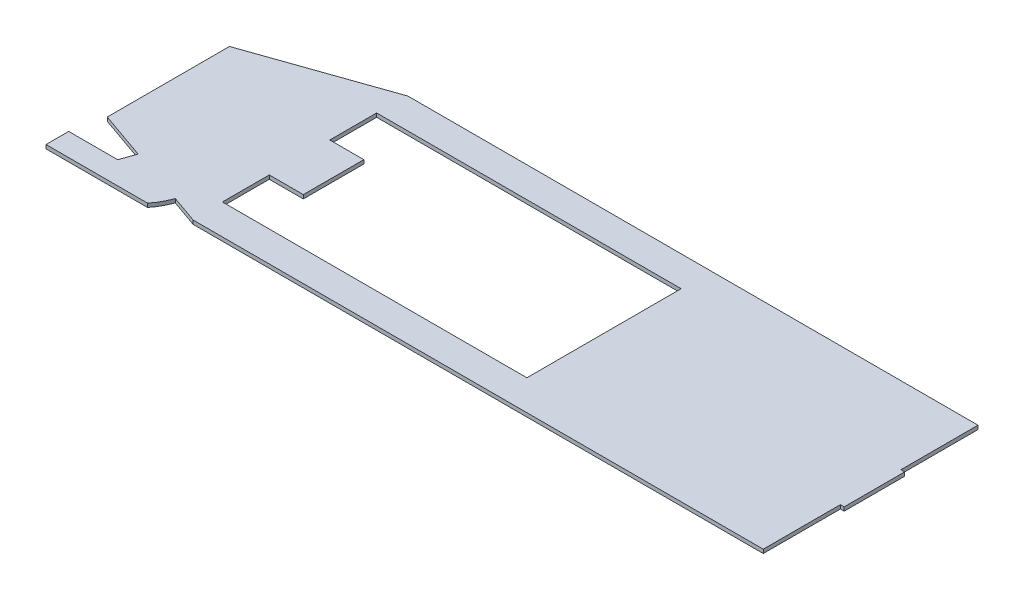
ISO-10303-21;
HEADER;
FILE_DESCRIPTION(('STEP AP214'),'2;1');
FILE_NAME('part.step','',(''),(''),'','','');
FILE_SCHEMA(('AUTOMOTIVE_DESIGN { 1 0 10303 214 1 1 1 1 }'));
ENDSEC;
DATA;
#1=APPLICATION_CONTEXT('core data for automotive mechanical design processes');
#2=APPLICATION_PROTOCOL_DEFINITION('international standard','automotive_design',2000,#1);
#3=PRODUCT_CONTEXT('',#1,'mechanical');
#4=PRODUCT('Part','Part','',(#3));
#5=PRODUCT_RELATED_PRODUCT_CATEGORY('part','',(#4));
#6=PRODUCT_DEFINITION_FORMATION('','',#4);
#7=PRODUCT_DEFINITION_CONTEXT('part definition',#1,'design');
#8=PRODUCT_DEFINITION('design','',#6,#7);
#9=PRODUCT_DEFINITION_SHAPE('','',#8);
#10=(LENGTH_UNIT() NAMED_UNIT(*) SI_UNIT(.MILLI.,.METRE.));
#11=(NAMED_UNIT(*) PLANE_ANGLE_UNIT() SI_UNIT($,.RADIAN.));
#12=(NAMED_UNIT(*) SI_UNIT($,.STERADIAN.) SOLID_ANGLE_UNIT());
#13=UNCERTAINTY_MEASURE_WITH_UNIT(LENGTH_MEASURE(1.E-05),#10,'distance_accuracy_value','');
#14=(GEOMETRIC_REPRESENTATION_CONTEXT(3) GLOBAL_UNCERTAINTY_ASSIGNED_CONTEXT((#13)) GLOBAL_UNIT_ASSIGNED_CONTEXT((#10,
#11,#12)) REPRESENTATION_CONTEXT('',''));
#15=CARTESIAN_POINT('',(0.,0.,0.));
#16=DIRECTION('',(0.,0.,1.));
#17=DIRECTION('',(1.,0.,0.));
#18=AXIS2_PLACEMENT_3D('',#15,#16,#17);
#19=CARTESIAN_POINT('',(-603.63124024629,-66.675,65.2465361820015));
#20=DIRECTION('',(0.,1.,0.));
#21=DIRECTION('',(0.,0.,1.));
#22=AXIS2_PLACEMENT_3D('',#19,#20,#21);
#23=CYLINDRICAL_SURFACE('',#22,50.8);
#24=CARTESIAN_POINT('',(-603.63124024629,-63.5,65.2465361820015));
#25=DIRECTION('',(0.,1.,0.));
#26=DIRECTION('',(0.,0.,1.));
#27=AXIS2_PLACEMENT_3D('',#24,#25,#26);
#28=CIRCLE('',#27,50.8);
#29=CARTESIAN_POINT('',(-555.683235742896,-63.5,82.0283377581893));
#30=VERTEX_POINT('',#29);
#31=CARTESIAN_POINT('',(-563.97550295646,-63.5,96.9965361820014));
#32=VERTEX_POINT('',#31);
#33=EDGE_CURVE('E250',#30,#32,#28,.F.);
#34=ORIENTED_EDGE('',*,*,#33,.T.);
#35=DIRECTION('',(0.,1.,0.));
#36=VECTOR('',#35,1.);
#37=CARTESIAN_POINT('',(-563.97550295646,-66.675,96.9965361820014));
#38=LINE('',#37,#36);
#39=CARTESIAN_POINT('',(-563.97550295646,-66.675,96.9965361820014));
#40=VERTEX_POINT('',#39);
#41=EDGE_CURVE('E11',#40,#32,#38,.T.);
#42=ORIENTED_EDGE('',*,*,#41,.F.);
#43=CARTESIAN_POINT('',(-603.63124024629,-66.675,65.2465361820015));
#44=DIRECTION('',(0.,1.,0.));
#45=DIRECTION('',(0.,0.,1.));
#46=AXIS2_PLACEMENT_3D('',#43,#44,#45);
#47=CIRCLE('',#46,50.8);
#48=CARTESIAN_POINT('',(-555.683235742896,-66.675,82.0283377581893));
#49=VERTEX_POINT('',#48);
#50=EDGE_CURVE('E54',#49,#40,#47,.F.);
#51=ORIENTED_EDGE('',*,*,#50,.F.);
#52=DIRECTION('',(0.,1.,0.));
#53=VECTOR('',#52,1.);
#54=CARTESIAN_POINT('',(-555.683235742896,-66.675,82.0283377581893));
#55=LINE('',#54,#53);
#56=EDGE_CURVE('E316',#49,#30,#55,.T.);
#57=ORIENTED_EDGE('',*,*,#56,.T.);
#58=EDGE_LOOP('',(#34,#42,#51,#57));
#59=FACE_BOUND('',#58,.T.);
#60=ADVANCED_FACE('F35',(#59),#23,.T.);
#61=CARTESIAN_POINT('',(0.,-66.675,96.9965361820015));
#62=DIRECTION('',(0.,0.,1.));
#63=DIRECTION('',(1.,0.,0.));
#64=AXIS2_PLACEMENT_3D('',#61,#62,#63);
#65=PLANE('',#64);
#66=DIRECTION('',(1.,0.,0.));
#67=VECTOR('',#66,1.);
#68=CARTESIAN_POINT('',(0.,-63.5,96.9965361820015));
#69=LINE('',#68,#67);
#70=CARTESIAN_POINT('',(-649.234193243362,-63.5,96.9965361820014));
#71=VERTEX_POINT('',#70);
#72=EDGE_CURVE('E284',#71,#32,#69,.T.);
#73=ORIENTED_EDGE('',*,*,#72,.F.);
#74=DIRECTION('',(0.,1.,0.));
#75=VECTOR('',#74,1.);
#76=CARTESIAN_POINT('',(-649.234193243362,-66.675,96.9965361820014));
#77=LINE('',#76,#75);
#78=CARTESIAN_POINT('',(-649.234193243362,-66.675,96.9965361820014));
#79=VERTEX_POINT('',#78);
#80=EDGE_CURVE('E45',#79,#71,#77,.T.);
#81=ORIENTED_EDGE('',*,*,#80,.F.);
#82=DIRECTION('',(1.,0.,0.));
#83=VECTOR('',#82,1.);
#84=CARTESIAN_POINT('',(0.,-66.675,96.9965361820015));
#85=LINE('',#84,#83);
#86=EDGE_CURVE('E222',#79,#40,#85,.T.);
#87=ORIENTED_EDGE('',*,*,#86,.T.);
#88=ORIENTED_EDGE('',*,*,#41,.T.);
#89=EDGE_LOOP('',(#73,#81,#87,#88));
#90=FACE_BOUND('',#89,.T.);
#91=ADVANCED_FACE('F450',(#90),#65,.T.);
#92=CARTESIAN_POINT('',(-649.234193243362,-66.675,0.));
#93=DIRECTION('',(-1.,0.,0.));
#94=DIRECTION('',(0.,0.,1.));
#95=AXIS2_PLACEMENT_3D('',#92,#93,#94);
#96=PLANE('',#95);
#97=DIRECTION('',(0.,0.,1.));
#98=VECTOR('',#97,1.);
#99=CARTESIAN_POINT('',(-649.234193243362,-63.5,0.));
#100=LINE('',#99,#98);
#101=CARTESIAN_POINT('',(-649.234193243362,-63.5,77.9465361820014));
#102=VERTEX_POINT('',#101);
#103=EDGE_CURVE('E210',#102,#71,#100,.T.);
#104=ORIENTED_EDGE('',*,*,#103,.F.);
#105=DIRECTION('',(0.,1.,0.));
#106=VECTOR('',#105,1.);
#107=CARTESIAN_POINT('',(-649.234193243362,-66.675,77.9465361820014));
#108=LINE('',#107,#106);
#109=CARTESIAN_POINT('',(-649.234193243362,-66.675,77.9465361820014));
#110=VERTEX_POINT('',#109);
#111=EDGE_CURVE('E206',#110,#102,#108,.T.);
#112=ORIENTED_EDGE('',*,*,#111,.F.);
#113=DIRECTION('',(0.,0.,1.));
#114=VECTOR('',#113,1.);
#115=CARTESIAN_POINT('',(-649.234193243362,-66.675,0.));
#116=LINE('',#115,#114);
#117=EDGE_CURVE('E209',#110,#79,#116,.T.);
#118=ORIENTED_EDGE('',*,*,#117,.T.);
#119=ORIENTED_EDGE('',*,*,#80,.T.);
#120=EDGE_LOOP('',(#104,#112,#118,#119));
#121=FACE_BOUND('',#120,.T.);
#122=ADVANCED_FACE('F208',(#121),#96,.T.);
#123=CARTESIAN_POINT('',(0.,-66.675,77.9465361820014));
#124=DIRECTION('',(0.,0.,-1.));
#125=DIRECTION('',(-1.,0.,0.));
#126=AXIS2_PLACEMENT_3D('',#123,#124,#125);
#127=PLANE('',#126);
#128=DIRECTION('',(-1.,0.,0.));
#129=VECTOR('',#128,1.);
#130=CARTESIAN_POINT('',(0.,-63.5,77.9465361820014));
#131=LINE('',#130,#129);
#132=CARTESIAN_POINT('',(-608.07624024629,-63.5,77.9465361820015));
#133=VERTEX_POINT('',#132);
#134=EDGE_CURVE('E281',#133,#102,#131,.T.);
#135=ORIENTED_EDGE('',*,*,#134,.F.);
#136=DIRECTION('',(0.,1.,0.));
#137=VECTOR('',#136,1.);
#138=CARTESIAN_POINT('',(-608.07624024629,-66.675,77.9465361820015));
#139=LINE('',#138,#137);
#140=CARTESIAN_POINT('',(-608.07624024629,-66.675,77.9465361820015));
#141=VERTEX_POINT('',#140);
#142=EDGE_CURVE('E215',#141,#133,#139,.T.);
#143=ORIENTED_EDGE('',*,*,#142,.F.);
#144=DIRECTION('',(-1.,0.,0.));
#145=VECTOR('',#144,1.);
#146=CARTESIAN_POINT('',(0.,-66.675,77.9465361820014));
#147=LINE('',#146,#145);
#148=EDGE_CURVE('E220',#141,#110,#147,.T.);
#149=ORIENTED_EDGE('',*,*,#148,.T.);
#150=ORIENTED_EDGE('',*,*,#111,.T.);
#151=EDGE_LOOP('',(#135,#143,#149,#150));
#152=FACE_BOUND('',#151,.T.);
#153=ADVANCED_FACE('F224',(#152),#127,.T.);
#154=CARTESIAN_POINT('',(-517.411984483368,-66.675,-181.09419456919));
#155=DIRECTION('',(-0.943858356366011,0.,-0.330350424728124));
#156=DIRECTION('',(-0.330350424728124,0.,0.943858356366011));
#157=AXIS2_PLACEMENT_3D('',#154,#155,#156);
#158=PLANE('',#157);
#159=DIRECTION('',(-0.330350424728124,0.,0.943858356366011));
#160=VECTOR('',#159,1.);
#161=CARTESIAN_POINT('',(-517.411984483368,-63.5,-181.09419456919));
#162=LINE('',#161,#160);
#163=CARTESIAN_POINT('',(-603.63124024629,-63.5,65.2465361820015));
#164=VERTEX_POINT('',#163);
#165=EDGE_CURVE('E278',#164,#133,#162,.T.);
#166=ORIENTED_EDGE('',*,*,#165,.F.);
#167=DIRECTION('',(0.,1.,0.));
#168=VECTOR('',#167,1.);
#169=CARTESIAN_POINT('',(-603.63124024629,-66.675,65.2465361820015));
#170=LINE('',#169,#168);
#171=CARTESIAN_POINT('',(-603.63124024629,-66.675,65.2465361820015));
#172=VERTEX_POINT('',#171);
#173=EDGE_CURVE('E290',#172,#164,#170,.T.);
#174=ORIENTED_EDGE('',*,*,#173,.F.);
#175=DIRECTION('',(-0.330350424728124,0.,0.943858356366011));
#176=VECTOR('',#175,1.);
#177=CARTESIAN_POINT('',(-517.411984483368,-66.675,-181.09419456919));
#178=LINE('',#177,#176);
#179=EDGE_CURVE('E225',#172,#141,#178,.T.);
#180=ORIENTED_EDGE('',*,*,#179,.T.);
#181=ORIENTED_EDGE('',*,*,#142,.T.);
#182=EDGE_LOOP('',(#166,#174,#180,#181));
#183=FACE_BOUND('',#182,.T.);
#184=ADVANCED_FACE('F405',(#183),#158,.T.);
#185=CARTESIAN_POINT('',(-86.2192557629139,-66.675,246.340730751183));
#186=DIRECTION('',(-0.330350424728106,0.,0.943858356366017));
#187=DIRECTION('',(0.943858356366018,0.,0.330350424728106));
#188=AXIS2_PLACEMENT_3D('',#185,#186,#187);
#189=PLANE('',#188);
#190=DIRECTION('',(0.943858356366018,0.,0.330350424728106));
#191=VECTOR('',#190,1.);
#192=CARTESIAN_POINT('',(-86.2192557629139,-63.5,246.340730751183));
#193=LINE('',#192,#191);
#194=CARTESIAN_POINT('',(-643.519193243362,-63.5,51.2857526330261));
#195=VERTEX_POINT('',#194);
#196=EDGE_CURVE('E256',#195,#164,#193,.T.);
#197=ORIENTED_EDGE('',*,*,#196,.F.);
#198=DIRECTION('',(0.,1.,0.));
#199=VECTOR('',#198,1.);
#200=CARTESIAN_POINT('',(-643.519193243362,-66.675,51.2857526330261));
#201=LINE('',#200,#199);
#202=CARTESIAN_POINT('',(-643.519193243362,-66.675,51.2857526330261));
#203=VERTEX_POINT('',#202);
#204=EDGE_CURVE('E292',#203,#195,#201,.T.);
#205=ORIENTED_EDGE('',*,*,#204,.F.);
#206=DIRECTION('',(0.943858356366018,0.,0.330350424728106));
#207=VECTOR('',#206,1.);
#208=CARTESIAN_POINT('',(-86.2192557629139,-66.675,246.340730751183));
#209=LINE('',#208,#207);
#210=EDGE_CURVE('E227',#203,#172,#209,.T.);
#211=ORIENTED_EDGE('',*,*,#210,.T.);
#212=ORIENTED_EDGE('',*,*,#173,.T.);
#213=EDGE_LOOP('',(#197,#205,#211,#212));
#214=FACE_BOUND('',#213,.T.);
#215=ADVANCED_FACE('F401',(#214),#189,.T.);
#216=CARTESIAN_POINT('',(-643.519193243362,-66.675,0.));
#217=DIRECTION('',(-1.,0.,0.));
#218=DIRECTION('',(0.,0.,1.));
#219=AXIS2_PLACEMENT_3D('',#216,#217,#218);
#220=PLANE('',#219);
#221=DIRECTION('',(0.,0.,1.));
#222=VECTOR('',#221,1.);
#223=CARTESIAN_POINT('',(-643.519193243362,-63.5,0.));
#224=LINE('',#223,#222);
#225=CARTESIAN_POINT('',(-643.519193243362,-63.5,-51.285752633026));
#226=VERTEX_POINT('',#225);
#227=EDGE_CURVE('E275',#226,#195,#224,.T.);
#228=ORIENTED_EDGE('',*,*,#227,.F.);
#229=DIRECTION('',(0.,1.,0.));
#230=VECTOR('',#229,1.);
#231=CARTESIAN_POINT('',(-643.519193243362,-66.675,-51.285752633026));
#232=LINE('',#231,#230);
#233=CARTESIAN_POINT('',(-643.519193243362,-66.675,-51.285752633026));
#234=VERTEX_POINT('',#233);
#235=EDGE_CURVE('E294',#234,#226,#232,.T.);
#236=ORIENTED_EDGE('',*,*,#235,.F.);
#237=DIRECTION('',(0.,0.,1.));
#238=VECTOR('',#237,1.);
#239=CARTESIAN_POINT('',(-643.519193243362,-66.675,0.));
#240=LINE('',#239,#238);
#241=EDGE_CURVE('E393',#234,#203,#240,.T.);
#242=ORIENTED_EDGE('',*,*,#241,.T.);
#243=ORIENTED_EDGE('',*,*,#204,.T.);
#244=EDGE_LOOP('',(#228,#236,#242,#243));
#245=FACE_BOUND('',#244,.T.);
#246=ADVANCED_FACE('F410',(#245),#220,.T.);
#247=CARTESIAN_POINT('',(-86.219255762914,-66.675,-246.340730751183));
#248=DIRECTION('',(-0.330350424728106,0.,-0.943858356366017));
#249=DIRECTION('',(-0.943858356366018,0.,0.330350424728106));
#250=AXIS2_PLACEMENT_3D('',#247,#248,#249);
#251=PLANE('',#250);
#252=DIRECTION('',(-0.943858356366018,0.,0.330350424728106));
#253=VECTOR('',#252,1.);
#254=CARTESIAN_POINT('',(-86.219255762914,-63.5,-246.340730751183));
#255=LINE('',#254,#253);
#256=CARTESIAN_POINT('',(-532.530200766293,-63.5,-90.1319));
#257=VERTEX_POINT('',#256);
#258=EDGE_CURVE('E272',#257,#226,#255,.T.);
#259=ORIENTED_EDGE('',*,*,#258,.F.);
#260=DIRECTION('',(0.,1.,0.));
#261=VECTOR('',#260,1.);
#262=CARTESIAN_POINT('',(-532.530200766293,-66.675,-90.1319));
#263=LINE('',#262,#261);
#264=CARTESIAN_POINT('',(-532.530200766293,-66.675,-90.1319));
#265=VERTEX_POINT('',#264);
#266=EDGE_CURVE('E296',#265,#257,#263,.T.);
#267=ORIENTED_EDGE('',*,*,#266,.F.);
#268=DIRECTION('',(-0.943858356366018,0.,0.330350424728106));
#269=VECTOR('',#268,1.);
#270=CARTESIAN_POINT('',(-86.219255762914,-66.675,-246.340730751183));
#271=LINE('',#270,#269);
#272=EDGE_CURVE('E391',#265,#234,#271,.T.);
#273=ORIENTED_EDGE('',*,*,#272,.T.);
#274=ORIENTED_EDGE('',*,*,#235,.T.);
#275=EDGE_LOOP('',(#259,#267,#273,#274));
#276=FACE_BOUND('',#275,.T.);
#277=ADVANCED_FACE('F412',(#276),#251,.T.);
#278=CARTESIAN_POINT('',(0.,-66.675,-90.1319000000001));
#279=DIRECTION('',(0.,0.,-1.));
#280=DIRECTION('',(-1.,0.,0.));
#281=AXIS2_PLACEMENT_3D('',#278,#279,#280);
#282=PLANE('',#281);
#283=DIRECTION('',(-1.,0.,0.));
#284=VECTOR('',#283,1.);
#285=CARTESIAN_POINT('',(0.,-63.5,-90.1319000000001));
#286=LINE('',#285,#284);
#287=CARTESIAN_POINT('',(-53.975,-63.5,-90.1319000000001));
#288=VERTEX_POINT('',#287);
#289=EDGE_CURVE('E269',#288,#257,#286,.T.);
#290=ORIENTED_EDGE('',*,*,#289,.F.);
#291=DIRECTION('',(0.,1.,0.));
#292=VECTOR('',#291,1.);
#293=CARTESIAN_POINT('',(-53.975,-66.675,-90.1319000000001));
#294=LINE('',#293,#292);
#295=CARTESIAN_POINT('',(-53.975,-66.675,-90.1319000000001));
#296=VERTEX_POINT('',#295);
#297=EDGE_CURVE('E298',#296,#288,#294,.T.);
#298=ORIENTED_EDGE('',*,*,#297,.F.);
#299=DIRECTION('',(-1.,0.,0.));
#300=VECTOR('',#299,1.);
#301=CARTESIAN_POINT('',(0.,-66.675,-90.1319000000001));
#302=LINE('',#301,#300);
#303=EDGE_CURVE('E388',#296,#265,#302,.T.);
#304=ORIENTED_EDGE('',*,*,#303,.T.);
#305=ORIENTED_EDGE('',*,*,#266,.T.);
#306=EDGE_LOOP('',(#290,#298,#304,#305));
#307=FACE_BOUND('',#306,.T.);
#308=ADVANCED_FACE('F416',(#307),#282,.T.);
#309=CARTESIAN_POINT('',(-53.975,-66.675,0.));
#310=DIRECTION('',(-1.,0.,0.));
#311=DIRECTION('',(0.,0.,1.));
#312=AXIS2_PLACEMENT_3D('',#309,#310,#311);
#313=PLANE('',#312);
#314=DIRECTION('',(0.,0.,1.));
#315=VECTOR('',#314,1.);
#316=CARTESIAN_POINT('',(-53.975,-63.5,0.));
#317=LINE('',#316,#315);
#318=CARTESIAN_POINT('',(-53.975,-63.5,-25.4));
#319=VERTEX_POINT('',#318);
#320=EDGE_CURVE('E263',#288,#319,#317,.T.);
#321=ORIENTED_EDGE('',*,*,#320,.T.);
#322=DIRECTION('',(0.,1.,0.));
#323=VECTOR('',#322,1.);
#324=CARTESIAN_POINT('',(-53.975,-66.675,-25.4));
#325=LINE('',#324,#323);
#326=CARTESIAN_POINT('',(-53.975,-66.675,-25.4));
#327=VERTEX_POINT('',#326);
#328=EDGE_CURVE('E300',#327,#319,#325,.T.);
#329=ORIENTED_EDGE('',*,*,#328,.F.);
#330=DIRECTION('',(0.,0.,1.));
#331=VECTOR('',#330,1.);
#332=CARTESIAN_POINT('',(-53.975,-66.675,0.));
#333=LINE('',#332,#331);
#334=EDGE_CURVE('E382',#296,#327,#333,.T.);
#335=ORIENTED_EDGE('',*,*,#334,.F.);
#336=ORIENTED_EDGE('',*,*,#297,.T.);
#337=EDGE_LOOP('',(#321,#329,#335,#336));
#338=FACE_BOUND('',#337,.T.);
#339=ADVANCED_FACE('F421',(#338),#313,.F.);
#340=CARTESIAN_POINT('',(0.,-66.675,-25.4));
#341=DIRECTION('',(0.,0.,1.));
#342=DIRECTION('',(1.,0.,0.));
#343=AXIS2_PLACEMENT_3D('',#340,#341,#342);
#344=PLANE('',#343);
#345=DIRECTION('',(1.,0.,0.));
#346=VECTOR('',#345,1.);
#347=CARTESIAN_POINT('',(0.,-63.5,-25.4));
#348=LINE('',#347,#346);
#349=CARTESIAN_POINT('',(-50.8,-63.5,-25.4));
#350=VERTEX_POINT('',#349);
#351=EDGE_CURVE('E267',#319,#350,#348,.T.);
#352=ORIENTED_EDGE('',*,*,#351,.T.);
#353=DIRECTION('',(0.,1.,0.));
#354=VECTOR('',#353,1.);
#355=CARTESIAN_POINT('',(-50.8,-66.675,-25.4));
#356=LINE('',#355,#354);
#357=CARTESIAN_POINT('',(-50.8,-66.675,-25.4));
#358=VERTEX_POINT('',#357);
#359=EDGE_CURVE('E303',#358,#350,#356,.T.);
#360=ORIENTED_EDGE('',*,*,#359,.F.);
#361=DIRECTION('',(1.,0.,0.));
#362=VECTOR('',#361,1.);
#363=CARTESIAN_POINT('',(0.,-66.675,-25.4));
#364=LINE('',#363,#362);
#365=EDGE_CURVE('E386',#327,#358,#364,.T.);
#366=ORIENTED_EDGE('',*,*,#365,.F.);
#367=ORIENTED_EDGE('',*,*,#328,.T.);
#368=EDGE_LOOP('',(#352,#360,#366,#367));
#369=FACE_BOUND('',#368,.T.);
#370=ADVANCED_FACE('F427',(#369),#344,.F.);
#371=CARTESIAN_POINT('',(-50.8,-66.675,0.));
#372=DIRECTION('',(-1.,0.,0.));
#373=DIRECTION('',(0.,0.,1.));
#374=AXIS2_PLACEMENT_3D('',#371,#372,#373);
#375=PLANE('',#374);
#376=DIRECTION('',(0.,0.,1.));
#377=VECTOR('',#376,1.);
#378=CARTESIAN_POINT('',(-50.8,-63.5,0.));
#379=LINE('',#378,#377);
#380=CARTESIAN_POINT('',(-50.8,-63.5,25.4));
#381=VERTEX_POINT('',#380);
#382=EDGE_CURVE('E265',#350,#381,#379,.T.);
#383=ORIENTED_EDGE('',*,*,#382,.T.);
#384=DIRECTION('',(0.,1.,0.));
#385=VECTOR('',#384,1.);
#386=CARTESIAN_POINT('',(-50.8,-66.675,25.4));
#387=LINE('',#386,#385);
#388=CARTESIAN_POINT('',(-50.8,-66.675,25.4));
#389=VERTEX_POINT('',#388);
#390=EDGE_CURVE('E306',#389,#381,#387,.T.);
#391=ORIENTED_EDGE('',*,*,#390,.F.);
#392=DIRECTION('',(0.,0.,1.));
#393=VECTOR('',#392,1.);
#394=CARTESIAN_POINT('',(-50.8,-66.675,0.));
#395=LINE('',#394,#393);
#396=EDGE_CURVE('E384',#358,#389,#395,.T.);
#397=ORIENTED_EDGE('',*,*,#396,.F.);
#398=ORIENTED_EDGE('',*,*,#359,.T.);
#399=EDGE_LOOP('',(#383,#391,#397,#398));
#400=FACE_BOUND('',#399,.T.);
#401=ADVANCED_FACE('F431',(#400),#375,.F.);
#402=CARTESIAN_POINT('',(0.,-66.675,25.4));
#403=DIRECTION('',(0.,0.,-1.));
#404=DIRECTION('',(-1.,0.,0.));
#405=AXIS2_PLACEMENT_3D('',#402,#403,#404);
#406=PLANE('',#405);
#407=DIRECTION('',(-1.,0.,0.));
#408=VECTOR('',#407,1.);
#409=CARTESIAN_POINT('',(0.,-63.5,25.4));
#410=LINE('',#409,#408);
#411=CARTESIAN_POINT('',(-53.975,-63.5,25.4));
#412=VERTEX_POINT('',#411);
#413=EDGE_CURVE('E262',#381,#412,#410,.T.);
#414=ORIENTED_EDGE('',*,*,#413,.T.);
#415=DIRECTION('',(0.,1.,0.));
#416=VECTOR('',#415,1.);
#417=CARTESIAN_POINT('',(-53.975,-66.675,25.4));
#418=LINE('',#417,#416);
#419=CARTESIAN_POINT('',(-53.975,-66.675,25.4));
#420=VERTEX_POINT('',#419);
#421=EDGE_CURVE('E309',#420,#412,#418,.T.);
#422=ORIENTED_EDGE('',*,*,#421,.F.);
#423=DIRECTION('',(-1.,0.,0.));
#424=VECTOR('',#423,1.);
#425=CARTESIAN_POINT('',(0.,-66.675,25.4));
#426=LINE('',#425,#424);
#427=EDGE_CURVE('E381',#389,#420,#426,.T.);
#428=ORIENTED_EDGE('',*,*,#427,.F.);
#429=ORIENTED_EDGE('',*,*,#390,.T.);
#430=EDGE_LOOP('',(#414,#422,#428,#429));
#431=FACE_BOUND('',#430,.T.);
#432=ADVANCED_FACE('F436',(#431),#406,.F.);
#433=CARTESIAN_POINT('',(-53.975,-63.5,90.1319000000001));
#434=VERTEX_POINT('',#433);
#435=EDGE_CURVE('E259',#412,#434,#317,.T.);
#436=ORIENTED_EDGE('',*,*,#435,.T.);
#437=DIRECTION('',(0.,1.,0.));
#438=VECTOR('',#437,1.);
#439=CARTESIAN_POINT('',(-53.975,-66.675,90.1319000000001));
#440=LINE('',#439,#438);
#441=CARTESIAN_POINT('',(-53.975,-66.675,90.1319000000001));
#442=VERTEX_POINT('',#441);
#443=EDGE_CURVE('E312',#442,#434,#440,.T.);
#444=ORIENTED_EDGE('',*,*,#443,.F.);
#445=EDGE_CURVE('E379',#420,#442,#333,.T.);
#446=ORIENTED_EDGE('',*,*,#445,.F.);
#447=ORIENTED_EDGE('',*,*,#421,.T.);
#448=EDGE_LOOP('',(#436,#444,#446,#447));
#449=FACE_BOUND('',#448,.T.);
#450=ADVANCED_FACE('F441',(#449),#313,.F.);
#451=CARTESIAN_POINT('',(0.,-66.675,90.1319000000001));
#452=DIRECTION('',(0.,0.,1.));
#453=DIRECTION('',(1.,0.,0.));
#454=AXIS2_PLACEMENT_3D('',#451,#452,#453);
#455=PLANE('',#454);
#456=DIRECTION('',(1.,0.,0.));
#457=VECTOR('',#456,1.);
#458=CARTESIAN_POINT('',(0.,-63.5,90.1319000000001));
#459=LINE('',#458,#457);
#460=CARTESIAN_POINT('',(-532.530200766293,-63.5,90.1319000000002));
#461=VERTEX_POINT('',#460);
#462=EDGE_CURVE('E255',#461,#434,#459,.T.);
#463=ORIENTED_EDGE('',*,*,#462,.F.);
#464=DIRECTION('',(0.,1.,0.));
#465=VECTOR('',#464,1.);
#466=CARTESIAN_POINT('',(-532.530200766293,-66.675,90.1319000000002));
#467=LINE('',#466,#465);
#468=CARTESIAN_POINT('',(-532.530200766293,-66.675,90.1319000000002));
#469=VERTEX_POINT('',#468);
#470=EDGE_CURVE('E314',#469,#461,#467,.T.);
#471=ORIENTED_EDGE('',*,*,#470,.F.);
#472=DIRECTION('',(1.,0.,0.));
#473=VECTOR('',#472,1.);
#474=CARTESIAN_POINT('',(0.,-66.675,90.1319000000001));
#475=LINE('',#474,#473);
#476=EDGE_CURVE('E376',#469,#442,#475,.T.);
#477=ORIENTED_EDGE('',*,*,#476,.T.);
#478=ORIENTED_EDGE('',*,*,#443,.T.);
#479=EDGE_LOOP('',(#463,#471,#477,#478));
#480=FACE_BOUND('',#479,.T.);
#481=ADVANCED_FACE('F445',(#480),#455,.T.);
#482=CARTESIAN_POINT('',(-533.4,-66.675,0.));
#483=DIRECTION('',(-1.,0.,0.));
#484=DIRECTION('',(0.,0.,1.));
#485=AXIS2_PLACEMENT_3D('',#482,#483,#484);
#486=PLANE('',#485);
#487=DIRECTION('',(0.,0.,1.));
#488=VECTOR('',#487,1.);
#489=CARTESIAN_POINT('',(-533.4,-63.5,0.));
#490=LINE('',#489,#488);
#491=CARTESIAN_POINT('',(-533.4,-63.5,-64.7319));
#492=VERTEX_POINT('',#491);
#493=CARTESIAN_POINT('',(-533.4,-63.5,-25.3999999999999));
#494=VERTEX_POINT('',#493);
#495=EDGE_CURVE('E232',#492,#494,#490,.T.);
#496=ORIENTED_EDGE('',*,*,#495,.T.);
#497=DIRECTION('',(0.,1.,0.));
#498=VECTOR('',#497,1.);
#499=CARTESIAN_POINT('',(-533.4,-66.675,-25.3999999999999));
#500=LINE('',#499,#498);
#501=CARTESIAN_POINT('',(-533.4,-66.675,-25.3999999999999));
#502=VERTEX_POINT('',#501);
#503=EDGE_CURVE('E318',#502,#494,#500,.T.);
#504=ORIENTED_EDGE('',*,*,#503,.F.);
#505=DIRECTION('',(0.,0.,1.));
#506=VECTOR('',#505,1.);
#507=CARTESIAN_POINT('',(-533.4,-66.675,0.));
#508=LINE('',#507,#506);
#509=CARTESIAN_POINT('',(-533.4,-66.675,-64.7319));
#510=VERTEX_POINT('',#509);
#511=EDGE_CURVE('E286',#510,#502,#508,.T.);
#512=ORIENTED_EDGE('',*,*,#511,.F.);
#513=DIRECTION('',(0.,1.,0.));
#514=VECTOR('',#513,1.);
#515=CARTESIAN_POINT('',(-533.4,-66.675,-64.7319));
#516=LINE('',#515,#514);
#517=EDGE_CURVE('E39',#510,#492,#516,.T.);
#518=ORIENTED_EDGE('',*,*,#517,.T.);
#519=EDGE_LOOP('',(#496,#504,#512,#518));
#520=FACE_BOUND('',#519,.T.);
#521=ADVANCED_FACE('F341',(#520),#486,.F.);
#522=CARTESIAN_POINT('',(0.,-66.675,-25.3999999999999));
#523=DIRECTION('',(0.,0.,1.));
#524=DIRECTION('',(1.,0.,0.));
#525=AXIS2_PLACEMENT_3D('',#522,#523,#524);
#526=PLANE('',#525);
#527=DIRECTION('',(1.,0.,0.));
#528=VECTOR('',#527,1.);
#529=CARTESIAN_POINT('',(0.,-63.5,-25.3999999999999));
#530=LINE('',#529,#528);
#531=CARTESIAN_POINT('',(-504.825,-63.5,-25.3999999999999));
#532=VERTEX_POINT('',#531);
#533=EDGE_CURVE('E248',#494,#532,#530,.T.);
#534=ORIENTED_EDGE('',*,*,#533,.T.);
#535=DIRECTION('',(0.,1.,0.));
#536=VECTOR('',#535,1.);
#537=CARTESIAN_POINT('',(-504.825,-66.675,-25.3999999999999));
#538=LINE('',#537,#536);
#539=CARTESIAN_POINT('',(-504.825,-66.675,-25.3999999999999));
#540=VERTEX_POINT('',#539);
#541=EDGE_CURVE('E321',#540,#532,#538,.T.);
#542=ORIENTED_EDGE('',*,*,#541,.F.);
#543=DIRECTION('',(1.,0.,0.));
#544=VECTOR('',#543,1.);
#545=CARTESIAN_POINT('',(0.,-66.675,-25.3999999999999));
#546=LINE('',#545,#544);
#547=EDGE_CURVE('E352',#502,#540,#546,.T.);
#548=ORIENTED_EDGE('',*,*,#547,.F.);
#549=ORIENTED_EDGE('',*,*,#503,.T.);
#550=EDGE_LOOP('',(#534,#542,#548,#549));
#551=FACE_BOUND('',#550,.T.);
#552=ADVANCED_FACE('F351',(#551),#526,.F.);
#553=CARTESIAN_POINT('',(-504.825,-66.675,0.));
#554=DIRECTION('',(-1.,0.,0.));
#555=DIRECTION('',(0.,0.,1.));
#556=AXIS2_PLACEMENT_3D('',#553,#554,#555);
#557=PLANE('',#556);
#558=DIRECTION('',(0.,0.,1.));
#559=VECTOR('',#558,1.);
#560=CARTESIAN_POINT('',(-504.825,-63.5,0.));
#561=LINE('',#560,#559);
#562=CARTESIAN_POINT('',(-504.825,-63.5,25.4000000000001));
#563=VERTEX_POINT('',#562);
#564=EDGE_CURVE('E246',#532,#563,#561,.T.);
#565=ORIENTED_EDGE('',*,*,#564,.T.);
#566=DIRECTION('',(0.,1.,0.));
#567=VECTOR('',#566,1.);
#568=CARTESIAN_POINT('',(-504.825,-66.675,25.4000000000001));
#569=LINE('',#568,#567);
#570=CARTESIAN_POINT('',(-504.825,-66.675,25.4000000000001));
#571=VERTEX_POINT('',#570);
#572=EDGE_CURVE('E324',#571,#563,#569,.T.);
#573=ORIENTED_EDGE('',*,*,#572,.F.);
#574=DIRECTION('',(0.,0.,1.));
#575=VECTOR('',#574,1.);
#576=CARTESIAN_POINT('',(-504.825,-66.675,0.));
#577=LINE('',#576,#575);
#578=EDGE_CURVE('E354',#540,#571,#577,.T.);
#579=ORIENTED_EDGE('',*,*,#578,.F.);
#580=ORIENTED_EDGE('',*,*,#541,.T.);
#581=EDGE_LOOP('',(#565,#573,#579,#580));
#582=FACE_BOUND('',#581,.T.);
#583=ADVANCED_FACE('F486',(#582),#557,.F.);
#584=CARTESIAN_POINT('',(0.,-66.675,25.4000000000001));
#585=DIRECTION('',(0.,0.,-1.));
#586=DIRECTION('',(-1.,0.,0.));
#587=AXIS2_PLACEMENT_3D('',#584,#585,#586);
#588=PLANE('',#587);
#589=DIRECTION('',(-1.,0.,0.));
#590=VECTOR('',#589,1.);
#591=CARTESIAN_POINT('',(0.,-63.5,25.4000000000001));
#592=LINE('',#591,#590);
#593=CARTESIAN_POINT('',(-533.4,-63.5,25.4000000000001));
#594=VERTEX_POINT('',#593);
#595=EDGE_CURVE('E244',#563,#594,#592,.T.);
#596=ORIENTED_EDGE('',*,*,#595,.T.);
#597=DIRECTION('',(0.,1.,0.));
#598=VECTOR('',#597,1.);
#599=CARTESIAN_POINT('',(-533.4,-66.675,25.4000000000001));
#600=LINE('',#599,#598);
#601=CARTESIAN_POINT('',(-533.4,-66.675,25.4000000000001));
#602=VERTEX_POINT('',#601);
#603=EDGE_CURVE('E327',#602,#594,#600,.T.);
#604=ORIENTED_EDGE('',*,*,#603,.F.);
#605=DIRECTION('',(-1.,0.,0.));
#606=VECTOR('',#605,1.);
#607=CARTESIAN_POINT('',(0.,-66.675,25.4000000000001));
#608=LINE('',#607,#606);
#609=EDGE_CURVE('E360',#571,#602,#608,.T.);
#610=ORIENTED_EDGE('',*,*,#609,.F.);
#611=ORIENTED_EDGE('',*,*,#572,.T.);
#612=EDGE_LOOP('',(#596,#604,#610,#611));
#613=FACE_BOUND('',#612,.T.);
#614=ADVANCED_FACE('F489',(#613),#588,.F.);
#615=CARTESIAN_POINT('',(-533.4,-63.5,64.7319000000001));
#616=VERTEX_POINT('',#615);
#617=EDGE_CURVE('E236',#594,#616,#490,.T.);
#618=ORIENTED_EDGE('',*,*,#617,.T.);
#619=DIRECTION('',(0.,1.,0.));
#620=VECTOR('',#619,1.);
#621=CARTESIAN_POINT('',(-533.4,-66.675,64.7319000000001));
#622=LINE('',#621,#620);
#623=CARTESIAN_POINT('',(-533.4,-66.675,64.7319000000001));
#624=VERTEX_POINT('',#623);
#625=EDGE_CURVE('E330',#624,#616,#622,.T.);
#626=ORIENTED_EDGE('',*,*,#625,.F.);
#627=EDGE_CURVE('E357',#602,#624,#508,.T.);
#628=ORIENTED_EDGE('',*,*,#627,.F.);
#629=ORIENTED_EDGE('',*,*,#603,.T.);
#630=EDGE_LOOP('',(#618,#626,#628,#629));
#631=FACE_BOUND('',#630,.T.);
#632=ADVANCED_FACE('F493',(#631),#486,.F.);
#633=CARTESIAN_POINT('',(0.,-66.675,64.7319000000001));
#634=DIRECTION('',(0.,0.,1.));
#635=DIRECTION('',(1.,0.,0.));
#636=AXIS2_PLACEMENT_3D('',#633,#634,#635);
#637=PLANE('',#636);
#638=DIRECTION('',(1.,0.,0.));
#639=VECTOR('',#638,1.);
#640=CARTESIAN_POINT('',(0.,-63.5,64.7319000000001));
#641=LINE('',#640,#639);
#642=CARTESIAN_POINT('',(-277.8125,-63.5,64.7319000000001));
#643=VERTEX_POINT('',#642);
#644=EDGE_CURVE('E241',#616,#643,#641,.T.);
#645=ORIENTED_EDGE('',*,*,#644,.T.);
#646=DIRECTION('',(0.,1.,0.));
#647=VECTOR('',#646,1.);
#648=CARTESIAN_POINT('',(-277.8125,-66.675,64.7319000000001));
#649=LINE('',#648,#647);
#650=CARTESIAN_POINT('',(-277.8125,-66.675,64.7319000000001));
#651=VERTEX_POINT('',#650);
#652=EDGE_CURVE('E333',#651,#643,#649,.T.);
#653=ORIENTED_EDGE('',*,*,#652,.F.);
#654=DIRECTION('',(1.,0.,0.));
#655=VECTOR('',#654,1.);
#656=CARTESIAN_POINT('',(0.,-66.675,64.7319000000001));
#657=LINE('',#656,#655);
#658=EDGE_CURVE('E361',#624,#651,#657,.T.);
#659=ORIENTED_EDGE('',*,*,#658,.F.);
#660=ORIENTED_EDGE('',*,*,#625,.T.);
#661=EDGE_LOOP('',(#645,#653,#659,#660));
#662=FACE_BOUND('',#661,.T.);
#663=ADVANCED_FACE('F497',(#662),#637,.F.);
#664=CARTESIAN_POINT('',(-277.8125,-66.675,0.));
#665=DIRECTION('',(-1.,0.,0.));
#666=DIRECTION('',(0.,0.,1.));
#667=AXIS2_PLACEMENT_3D('',#664,#665,#666);
#668=PLANE('',#667);
#669=DIRECTION('',(0.,0.,1.));
#670=VECTOR('',#669,1.);
#671=CARTESIAN_POINT('',(-277.8125,-63.5,0.));
#672=LINE('',#671,#670);
#673=CARTESIAN_POINT('',(-277.8125,-63.5,-64.7319));
#674=VERTEX_POINT('',#673);
#675=EDGE_CURVE('E238',#674,#643,#672,.T.);
#676=ORIENTED_EDGE('',*,*,#675,.F.);
#677=DIRECTION('',(0.,1.,0.));
#678=VECTOR('',#677,1.);
#679=CARTESIAN_POINT('',(-277.8125,-66.675,-64.7319));
#680=LINE('',#679,#678);
#681=CARTESIAN_POINT('',(-277.8125,-66.675,-64.7319));
#682=VERTEX_POINT('',#681);
#683=EDGE_CURVE('E334',#682,#674,#680,.T.);
#684=ORIENTED_EDGE('',*,*,#683,.F.);
#685=DIRECTION('',(0.,0.,1.));
#686=VECTOR('',#685,1.);
#687=CARTESIAN_POINT('',(-277.8125,-66.675,0.));
#688=LINE('',#687,#686);
#689=EDGE_CURVE('E358',#682,#651,#688,.T.);
#690=ORIENTED_EDGE('',*,*,#689,.T.);
#691=ORIENTED_EDGE('',*,*,#652,.T.);
#692=EDGE_LOOP('',(#676,#684,#690,#691));
#693=FACE_BOUND('',#692,.T.);
#694=ADVANCED_FACE('F500',(#693),#668,.T.);
#695=CARTESIAN_POINT('',(0.,-66.675,-64.7319000000001));
#696=DIRECTION('',(0.,0.,-1.));
#697=DIRECTION('',(-1.,0.,0.));
#698=AXIS2_PLACEMENT_3D('',#695,#696,#697);
#699=PLANE('',#698);
#700=DIRECTION('',(-1.,0.,0.));
#701=VECTOR('',#700,1.);
#702=CARTESIAN_POINT('',(0.,-63.5,-64.7319000000001));
#703=LINE('',#702,#701);
#704=EDGE_CURVE('E235',#674,#492,#703,.T.);
#705=ORIENTED_EDGE('',*,*,#704,.T.);
#706=ORIENTED_EDGE('',*,*,#517,.F.);
#707=DIRECTION('',(-1.,0.,0.));
#708=VECTOR('',#707,1.);
#709=CARTESIAN_POINT('',(0.,-66.675,-64.7319000000001));
#710=LINE('',#709,#708);
#711=EDGE_CURVE('E144',#682,#510,#710,.T.);
#712=ORIENTED_EDGE('',*,*,#711,.F.);
#713=ORIENTED_EDGE('',*,*,#683,.T.);
#714=EDGE_LOOP('',(#705,#706,#712,#713));
#715=FACE_BOUND('',#714,.T.);
#716=ADVANCED_FACE('F37',(#715),#699,.F.);
#717=EDGE_CURVE('E252',#30,#461,#193,.T.);
#718=ORIENTED_EDGE('',*,*,#717,.F.);
#719=ORIENTED_EDGE('',*,*,#56,.F.);
#720=EDGE_CURVE('E373',#49,#469,#209,.T.);
#721=ORIENTED_EDGE('',*,*,#720,.T.);
#722=ORIENTED_EDGE('',*,*,#470,.T.);
#723=EDGE_LOOP('',(#718,#719,#721,#722));
#724=FACE_BOUND('',#723,.T.);
#725=ADVANCED_FACE('F448',(#724),#189,.T.);
#726=CARTESIAN_POINT('',(0.,-66.675,0.));
#727=DIRECTION('',(0.,1.,0.));
#728=DIRECTION('',(0.,0.,1.));
#729=AXIS2_PLACEMENT_3D('',#726,#727,#728);
#730=PLANE('',#729);
#731=ORIENTED_EDGE('',*,*,#511,.T.);
#732=ORIENTED_EDGE('',*,*,#547,.T.);
#733=ORIENTED_EDGE('',*,*,#578,.T.);
#734=ORIENTED_EDGE('',*,*,#609,.T.);
#735=ORIENTED_EDGE('',*,*,#627,.T.);
#736=ORIENTED_EDGE('',*,*,#658,.T.);
#737=ORIENTED_EDGE('',*,*,#689,.F.);
#738=ORIENTED_EDGE('',*,*,#711,.T.);
#739=EDGE_LOOP('',(#731,#732,#733,#734,#735,#736,#737,#738));
#740=FACE_BOUND('',#739,.T.);
#741=ORIENTED_EDGE('',*,*,#50,.T.);
#742=ORIENTED_EDGE('',*,*,#86,.F.);
#743=ORIENTED_EDGE('',*,*,#117,.F.);
#744=ORIENTED_EDGE('',*,*,#148,.F.);
#745=ORIENTED_EDGE('',*,*,#179,.F.);
#746=ORIENTED_EDGE('',*,*,#210,.F.);
#747=ORIENTED_EDGE('',*,*,#241,.F.);
#748=ORIENTED_EDGE('',*,*,#272,.F.);
#749=ORIENTED_EDGE('',*,*,#303,.F.);
#750=ORIENTED_EDGE('',*,*,#334,.T.);
#751=ORIENTED_EDGE('',*,*,#365,.T.);
#752=ORIENTED_EDGE('',*,*,#396,.T.);
#753=ORIENTED_EDGE('',*,*,#427,.T.);
#754=ORIENTED_EDGE('',*,*,#445,.T.);
#755=ORIENTED_EDGE('',*,*,#476,.F.);
#756=ORIENTED_EDGE('',*,*,#720,.F.);
#757=EDGE_LOOP('',(#741,#742,#743,#744,#745,#746,#747,#748,#749,#750,#751,#752,#753,#754,#755,#756));
#758=FACE_BOUND('',#757,.T.);
#759=ADVANCED_FACE('F218',(#740,#758),#730,.F.);
#760=CARTESIAN_POINT('',(0.,-63.5,0.));
#761=DIRECTION('',(0.,1.,0.));
#762=DIRECTION('',(0.,0.,1.));
#763=AXIS2_PLACEMENT_3D('',#760,#761,#762);
#764=PLANE('',#763);
#765=ORIENTED_EDGE('',*,*,#495,.F.);
#766=ORIENTED_EDGE('',*,*,#704,.F.);
#767=ORIENTED_EDGE('',*,*,#675,.T.);
#768=ORIENTED_EDGE('',*,*,#644,.F.);
#769=ORIENTED_EDGE('',*,*,#617,.F.);
#770=ORIENTED_EDGE('',*,*,#595,.F.);
#771=ORIENTED_EDGE('',*,*,#564,.F.);
#772=ORIENTED_EDGE('',*,*,#533,.F.);
#773=EDGE_LOOP('',(#765,#766,#767,#768,#769,#770,#771,#772));
#774=FACE_BOUND('',#773,.T.);
#775=ORIENTED_EDGE('',*,*,#33,.F.);
#776=ORIENTED_EDGE('',*,*,#717,.T.);
#777=ORIENTED_EDGE('',*,*,#462,.T.);
#778=ORIENTED_EDGE('',*,*,#435,.F.);
#779=ORIENTED_EDGE('',*,*,#413,.F.);
#780=ORIENTED_EDGE('',*,*,#382,.F.);
#781=ORIENTED_EDGE('',*,*,#351,.F.);
#782=ORIENTED_EDGE('',*,*,#320,.F.);
#783=ORIENTED_EDGE('',*,*,#289,.T.);
#784=ORIENTED_EDGE('',*,*,#258,.T.);
#785=ORIENTED_EDGE('',*,*,#227,.T.);
#786=ORIENTED_EDGE('',*,*,#196,.T.);
#787=ORIENTED_EDGE('',*,*,#165,.T.);
#788=ORIENTED_EDGE('',*,*,#134,.T.);
#789=ORIENTED_EDGE('',*,*,#103,.T.);
#790=ORIENTED_EDGE('',*,*,#72,.T.);
#791=EDGE_LOOP('',(#775,#776,#777,#778,#779,#780,#781,#782,#783,#784,#785,#786,#787,#788,#789,#790));
#792=FACE_BOUND('',#791,.T.);
#793=ADVANCED_FACE('F344',(#774,#792),#764,.T.);
#794=CLOSED_SHELL('',(#60,#91,#122,#153,#184,#215,#246,#277,#308,#339,#370,#401,#432,#450,#481,
#521,#552,#583,#614,#632,#663,#694,#716,#725,#759,#793));
#795=MANIFOLD_SOLID_BREP('B2',#794);
#796=ADVANCED_BREP_SHAPE_REPRESENTATION('',(#18,#795),#14);
#797=SHAPE_DEFINITION_REPRESENTATION(#9,#796);
ENDSEC;
END-ISO-10303-21;
